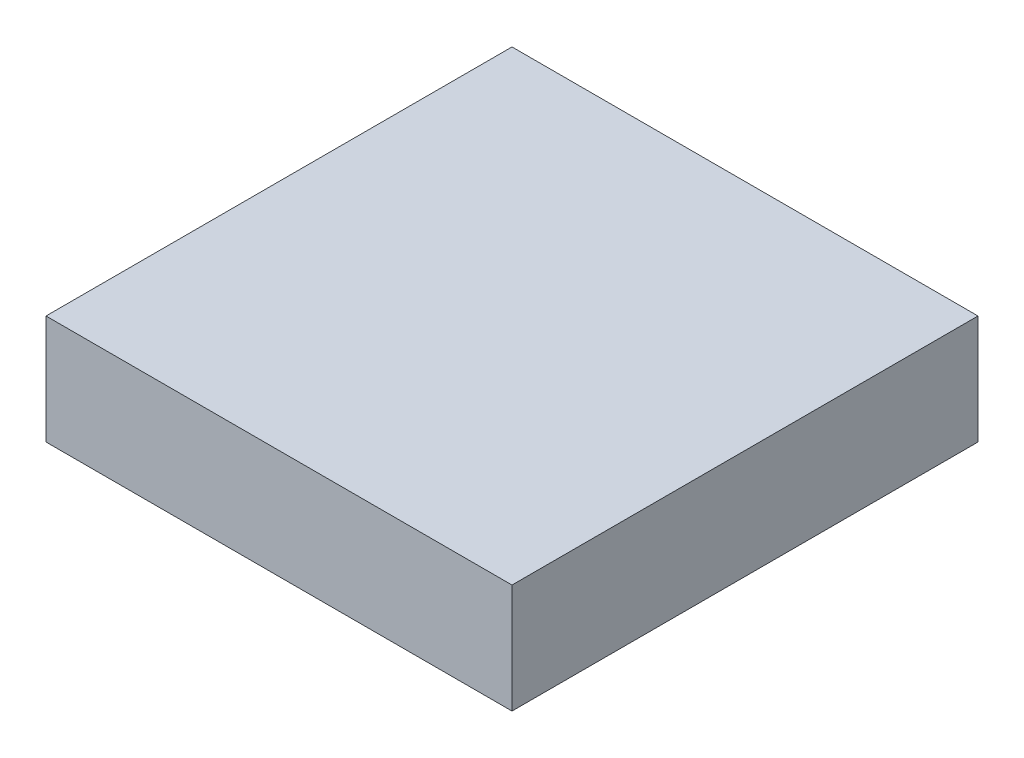
ISO-10303-21;
HEADER;
FILE_DESCRIPTION(('STEP AP214'),'2;1');
FILE_NAME('part.step','',(''),(''),'','','');
FILE_SCHEMA(('AUTOMOTIVE_DESIGN { 1 0 10303 214 1 1 1 1 }'));
ENDSEC;
DATA;
#1=APPLICATION_CONTEXT('core data for automotive mechanical design processes');
#2=APPLICATION_PROTOCOL_DEFINITION('international standard','automotive_design',2000,#1);
#3=PRODUCT_CONTEXT('',#1,'mechanical');
#4=PRODUCT('Part','Part','',(#3));
#5=PRODUCT_RELATED_PRODUCT_CATEGORY('part','',(#4));
#6=PRODUCT_DEFINITION_FORMATION('','',#4);
#7=PRODUCT_DEFINITION_CONTEXT('part definition',#1,'design');
#8=PRODUCT_DEFINITION('design','',#6,#7);
#9=PRODUCT_DEFINITION_SHAPE('','',#8);
#10=(LENGTH_UNIT() NAMED_UNIT(*) SI_UNIT(.MILLI.,.METRE.));
#11=(NAMED_UNIT(*) PLANE_ANGLE_UNIT() SI_UNIT($,.RADIAN.));
#12=(NAMED_UNIT(*) SI_UNIT($,.STERADIAN.) SOLID_ANGLE_UNIT());
#13=UNCERTAINTY_MEASURE_WITH_UNIT(LENGTH_MEASURE(1.E-05),#10,'distance_accuracy_value','');
#14=(GEOMETRIC_REPRESENTATION_CONTEXT(3) GLOBAL_UNCERTAINTY_ASSIGNED_CONTEXT((#13)) GLOBAL_UNIT_ASSIGNED_CONTEXT((#10,
#11,#12)) REPRESENTATION_CONTEXT('',''));
#15=CARTESIAN_POINT('',(0.,0.,0.));
#16=DIRECTION('',(0.,0.,1.));
#17=DIRECTION('',(1.,0.,0.));
#18=AXIS2_PLACEMENT_3D('',#15,#16,#17);
#19=CARTESIAN_POINT('',(143.,67.,143.));
#20=DIRECTION('',(-1.,0.,0.));
#21=DIRECTION('',(0.,0.,1.));
#22=AXIS2_PLACEMENT_3D('',#19,#20,#21);
#23=PLANE('',#22);
#24=DIRECTION('',(0.,0.,-1.));
#25=VECTOR('',#24,1.);
#26=CARTESIAN_POINT('',(143.,0.,143.));
#27=LINE('',#26,#25);
#28=CARTESIAN_POINT('',(143.,0.,143.));
#29=VERTEX_POINT('',#28);
#30=CARTESIAN_POINT('',(143.,0.,-143.));
#31=VERTEX_POINT('',#30);
#32=EDGE_CURVE('E95',#29,#31,#27,.T.);
#33=ORIENTED_EDGE('',*,*,#32,.T.);
#34=DIRECTION('',(0.,-1.,0.));
#35=VECTOR('',#34,1.);
#36=CARTESIAN_POINT('',(143.,67.,-143.));
#37=LINE('',#36,#35);
#38=CARTESIAN_POINT('',(143.,67.,-143.));
#39=VERTEX_POINT('',#38);
#40=EDGE_CURVE('E11',#39,#31,#37,.T.);
#41=ORIENTED_EDGE('',*,*,#40,.F.);
#42=DIRECTION('',(0.,0.,-1.));
#43=VECTOR('',#42,1.);
#44=CARTESIAN_POINT('',(143.,67.,143.));
#45=LINE('',#44,#43);
#46=CARTESIAN_POINT('',(143.,67.,143.));
#47=VERTEX_POINT('',#46);
#48=EDGE_CURVE('E83',#47,#39,#45,.T.);
#49=ORIENTED_EDGE('',*,*,#48,.F.);
#50=DIRECTION('',(0.,-1.,0.));
#51=VECTOR('',#50,1.);
#52=CARTESIAN_POINT('',(143.,67.,143.));
#53=LINE('',#52,#51);
#54=EDGE_CURVE('E91',#47,#29,#53,.T.);
#55=ORIENTED_EDGE('',*,*,#54,.T.);
#56=EDGE_LOOP('',(#33,#41,#49,#55));
#57=FACE_BOUND('',#56,.T.);
#58=ADVANCED_FACE('F32',(#57),#23,.F.);
#59=CARTESIAN_POINT('',(-143.,67.,-143.));
#60=DIRECTION('',(0.,0.,1.));
#61=DIRECTION('',(1.,0.,0.));
#62=AXIS2_PLACEMENT_3D('',#59,#60,#61);
#63=PLANE('',#62);
#64=DIRECTION('',(-1.,0.,0.));
#65=VECTOR('',#64,1.);
#66=CARTESIAN_POINT('',(-143.,0.,-143.));
#67=LINE('',#66,#65);
#68=CARTESIAN_POINT('',(-143.,0.,-143.));
#69=VERTEX_POINT('',#68);
#70=EDGE_CURVE('E87',#31,#69,#67,.T.);
#71=ORIENTED_EDGE('',*,*,#70,.T.);
#72=DIRECTION('',(0.,-1.,0.));
#73=VECTOR('',#72,1.);
#74=CARTESIAN_POINT('',(-143.,67.,-143.));
#75=LINE('',#74,#73);
#76=CARTESIAN_POINT('',(-143.,67.,-143.));
#77=VERTEX_POINT('',#76);
#78=EDGE_CURVE('E40',#77,#69,#75,.T.);
#79=ORIENTED_EDGE('',*,*,#78,.F.);
#80=DIRECTION('',(-1.,0.,0.));
#81=VECTOR('',#80,1.);
#82=CARTESIAN_POINT('',(-143.,67.,-143.));
#83=LINE('',#82,#81);
#84=EDGE_CURVE('E78',#39,#77,#83,.T.);
#85=ORIENTED_EDGE('',*,*,#84,.F.);
#86=ORIENTED_EDGE('',*,*,#40,.T.);
#87=EDGE_LOOP('',(#71,#79,#85,#86));
#88=FACE_BOUND('',#87,.T.);
#89=ADVANCED_FACE('F86',(#88),#63,.F.);
#90=CARTESIAN_POINT('',(-143.,67.,143.));
#91=DIRECTION('',(1.,0.,0.));
#92=DIRECTION('',(0.,0.,-1.));
#93=AXIS2_PLACEMENT_3D('',#90,#91,#92);
#94=PLANE('',#93);
#95=DIRECTION('',(0.,0.,1.));
#96=VECTOR('',#95,1.);
#97=CARTESIAN_POINT('',(-143.,0.,143.));
#98=LINE('',#97,#96);
#99=CARTESIAN_POINT('',(-143.,0.,143.));
#100=VERTEX_POINT('',#99);
#101=EDGE_CURVE('E65',#69,#100,#98,.T.);
#102=ORIENTED_EDGE('',*,*,#101,.T.);
#103=DIRECTION('',(0.,-1.,0.));
#104=VECTOR('',#103,1.);
#105=CARTESIAN_POINT('',(-143.,67.,143.));
#106=LINE('',#105,#104);
#107=CARTESIAN_POINT('',(-143.,67.,143.));
#108=VERTEX_POINT('',#107);
#109=EDGE_CURVE('E88',#108,#100,#106,.T.);
#110=ORIENTED_EDGE('',*,*,#109,.F.);
#111=DIRECTION('',(0.,0.,1.));
#112=VECTOR('',#111,1.);
#113=CARTESIAN_POINT('',(-143.,67.,143.));
#114=LINE('',#113,#112);
#115=EDGE_CURVE('E81',#77,#108,#114,.T.);
#116=ORIENTED_EDGE('',*,*,#115,.F.);
#117=ORIENTED_EDGE('',*,*,#78,.T.);
#118=EDGE_LOOP('',(#102,#110,#116,#117));
#119=FACE_BOUND('',#118,.T.);
#120=ADVANCED_FACE('F89',(#119),#94,.F.);
#121=CARTESIAN_POINT('',(-143.,67.,143.));
#122=DIRECTION('',(0.,0.,-1.));
#123=DIRECTION('',(-1.,0.,0.));
#124=AXIS2_PLACEMENT_3D('',#121,#122,#123);
#125=PLANE('',#124);
#126=DIRECTION('',(1.,0.,0.));
#127=VECTOR('',#126,1.);
#128=CARTESIAN_POINT('',(-143.,0.,143.));
#129=LINE('',#128,#127);
#130=EDGE_CURVE('E71',#100,#29,#129,.T.);
#131=ORIENTED_EDGE('',*,*,#130,.T.);
#132=ORIENTED_EDGE('',*,*,#54,.F.);
#133=DIRECTION('',(1.,0.,0.));
#134=VECTOR('',#133,1.);
#135=CARTESIAN_POINT('',(-143.,67.,143.));
#136=LINE('',#135,#134);
#137=EDGE_CURVE('E48',#108,#47,#136,.T.);
#138=ORIENTED_EDGE('',*,*,#137,.F.);
#139=ORIENTED_EDGE('',*,*,#109,.T.);
#140=EDGE_LOOP('',(#131,#132,#138,#139));
#141=FACE_BOUND('',#140,.T.);
#142=ADVANCED_FACE('F102',(#141),#125,.F.);
#143=CARTESIAN_POINT('',(0.,67.,0.));
#144=DIRECTION('',(0.,-1.,0.));
#145=DIRECTION('',(0.,0.,-1.));
#146=AXIS2_PLACEMENT_3D('',#143,#144,#145);
#147=PLANE('',#146);
#148=ORIENTED_EDGE('',*,*,#48,.T.);
#149=ORIENTED_EDGE('',*,*,#84,.T.);
#150=ORIENTED_EDGE('',*,*,#115,.T.);
#151=ORIENTED_EDGE('',*,*,#137,.T.);
#152=EDGE_LOOP('',(#148,#149,#150,#151));
#153=FACE_BOUND('',#152,.T.);
#154=ADVANCED_FACE('F79',(#153),#147,.F.);
#155=CARTESIAN_POINT('',(0.,0.,0.));
#156=DIRECTION('',(0.,-1.,0.));
#157=DIRECTION('',(0.,0.,-1.));
#158=AXIS2_PLACEMENT_3D('',#155,#156,#157);
#159=PLANE('',#158);
#160=ORIENTED_EDGE('',*,*,#32,.F.);
#161=ORIENTED_EDGE('',*,*,#130,.F.);
#162=ORIENTED_EDGE('',*,*,#101,.F.);
#163=ORIENTED_EDGE('',*,*,#70,.F.);
#164=EDGE_LOOP('',(#160,#161,#162,#163));
#165=FACE_BOUND('',#164,.T.);
#166=ADVANCED_FACE('F105',(#165),#159,.T.);
#167=CLOSED_SHELL('',(#58,#89,#120,#142,#154,#166));
#168=MANIFOLD_SOLID_BREP('B2',#167);
#169=ADVANCED_BREP_SHAPE_REPRESENTATION('',(#18,#168),#14);
#170=SHAPE_DEFINITION_REPRESENTATION(#9,#169);
ENDSEC;
END-ISO-10303-21;
